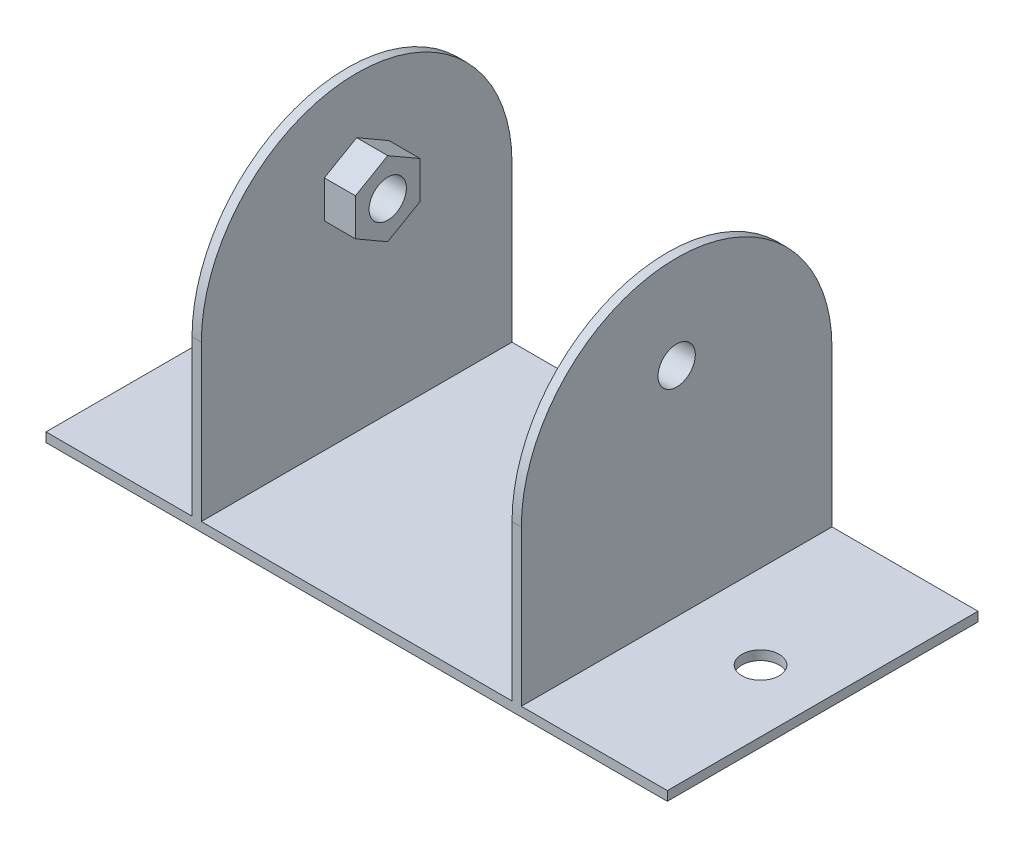
ISO-10303-21;
HEADER;
FILE_DESCRIPTION(('STEP AP214'),'2;1');
FILE_NAME('part.step','',(''),(''),'','','');
FILE_SCHEMA(('AUTOMOTIVE_DESIGN { 1 0 10303 214 1 1 1 1 }'));
ENDSEC;
DATA;
#1=APPLICATION_CONTEXT('core data for automotive mechanical design processes');
#2=APPLICATION_PROTOCOL_DEFINITION('international standard','automotive_design',2000,#1);
#3=PRODUCT_CONTEXT('',#1,'mechanical');
#4=PRODUCT('Part','Part','',(#3));
#5=PRODUCT_RELATED_PRODUCT_CATEGORY('part','',(#4));
#6=PRODUCT_DEFINITION_FORMATION('','',#4);
#7=PRODUCT_DEFINITION_CONTEXT('part definition',#1,'design');
#8=PRODUCT_DEFINITION('design','',#6,#7);
#9=PRODUCT_DEFINITION_SHAPE('','',#8);
#10=(LENGTH_UNIT() NAMED_UNIT(*) SI_UNIT(.MILLI.,.METRE.));
#11=(NAMED_UNIT(*) PLANE_ANGLE_UNIT() SI_UNIT($,.RADIAN.));
#12=(NAMED_UNIT(*) SI_UNIT($,.STERADIAN.) SOLID_ANGLE_UNIT());
#13=UNCERTAINTY_MEASURE_WITH_UNIT(LENGTH_MEASURE(1.E-05),#10,'distance_accuracy_value','');
#14=(GEOMETRIC_REPRESENTATION_CONTEXT(3) GLOBAL_UNCERTAINTY_ASSIGNED_CONTEXT((#13)) GLOBAL_UNIT_ASSIGNED_CONTEXT((#10,
#11,#12)) REPRESENTATION_CONTEXT('',''));
#15=CARTESIAN_POINT('',(0.,0.,0.));
#16=DIRECTION('',(0.,0.,1.));
#17=DIRECTION('',(1.,0.,0.));
#18=AXIS2_PLACEMENT_3D('',#15,#16,#17);
#19=CARTESIAN_POINT('',(-25.,50.,50.));
#20=DIRECTION('',(-1.,0.,0.));
#21=DIRECTION('',(0.,-1.,0.));
#22=AXIS2_PLACEMENT_3D('',#19,#20,#21);
#23=PLANE('',#22);
#24=DIRECTION('',(0.,1.,0.));
#25=VECTOR('',#24,1.);
#26=CARTESIAN_POINT('',(-25.,50.,0.));
#27=LINE('',#26,#25);
#28=CARTESIAN_POINT('',(-25.,0.,0.));
#29=VERTEX_POINT('',#28);
#30=CARTESIAN_POINT('',(-25.,25.,0.));
#31=VERTEX_POINT('',#30);
#32=EDGE_CURVE('E357',#29,#31,#27,.T.);
#33=ORIENTED_EDGE('',*,*,#32,.T.);
#34=CARTESIAN_POINT('',(-25.,25.,25.));
#35=DIRECTION('',(-1.,0.,0.));
#36=DIRECTION('',(0.,-1.,0.));
#37=AXIS2_PLACEMENT_3D('',#34,#35,#36);
#38=CIRCLE('',#37,25.);
#39=CARTESIAN_POINT('',(-25.,25.,50.));
#40=VERTEX_POINT('',#39);
#41=EDGE_CURVE('E44',#31,#40,#38,.F.);
#42=ORIENTED_EDGE('',*,*,#41,.T.);
#43=DIRECTION('',(0.,1.,0.));
#44=VECTOR('',#43,1.);
#45=CARTESIAN_POINT('',(-25.,50.,50.));
#46=LINE('',#45,#44);
#47=CARTESIAN_POINT('',(-25.,0.,50.));
#48=VERTEX_POINT('',#47);
#49=EDGE_CURVE('E334',#48,#40,#46,.T.);
#50=ORIENTED_EDGE('',*,*,#49,.F.);
#51=DIRECTION('',(0.,0.,-1.));
#52=VECTOR('',#51,1.);
#53=CARTESIAN_POINT('',(-25.,0.,50.));
#54=LINE('',#53,#52);
#55=EDGE_CURVE('E383',#48,#29,#54,.T.);
#56=ORIENTED_EDGE('',*,*,#55,.T.);
#57=EDGE_LOOP('',(#33,#42,#50,#56));
#58=FACE_BOUND('',#57,.T.);
#59=DIRECTION('',(0.,-1.,0.));
#60=VECTOR('',#59,1.);
#61=CARTESIAN_POINT('',(-25.,38.,30.1961524227066));
#62=LINE('',#61,#60);
#63=CARTESIAN_POINT('',(-25.,38.,30.1961524227066));
#64=VERTEX_POINT('',#63);
#65=CARTESIAN_POINT('',(-25.,32.,30.1961524227066));
#66=VERTEX_POINT('',#65);
#67=EDGE_CURVE('E258',#64,#66,#62,.T.);
#68=ORIENTED_EDGE('',*,*,#67,.F.);
#69=DIRECTION('',(0.,-0.5,0.866025403784438));
#70=VECTOR('',#69,1.);
#71=CARTESIAN_POINT('',(-25.,41.,25.));
#72=LINE('',#71,#70);
#73=CARTESIAN_POINT('',(-25.,41.,25.));
#74=VERTEX_POINT('',#73);
#75=EDGE_CURVE('E263',#74,#64,#72,.T.);
#76=ORIENTED_EDGE('',*,*,#75,.F.);
#77=DIRECTION('',(0.,0.5,0.866025403784439));
#78=VECTOR('',#77,1.);
#79=CARTESIAN_POINT('',(-25.,38.,19.8038475772934));
#80=LINE('',#79,#78);
#81=CARTESIAN_POINT('',(-25.,38.,19.8038475772934));
#82=VERTEX_POINT('',#81);
#83=EDGE_CURVE('E283',#82,#74,#80,.T.);
#84=ORIENTED_EDGE('',*,*,#83,.F.);
#85=DIRECTION('',(0.,1.,0.));
#86=VECTOR('',#85,1.);
#87=CARTESIAN_POINT('',(-25.,32.,19.8038475772934));
#88=LINE('',#87,#86);
#89=CARTESIAN_POINT('',(-25.,32.,19.8038475772934));
#90=VERTEX_POINT('',#89);
#91=EDGE_CURVE('E280',#90,#82,#88,.T.);
#92=ORIENTED_EDGE('',*,*,#91,.F.);
#93=DIRECTION('',(0.,0.500000000000001,-0.866025403784438));
#94=VECTOR('',#93,1.);
#95=CARTESIAN_POINT('',(-25.,29.,25.));
#96=LINE('',#95,#94);
#97=CARTESIAN_POINT('',(-25.,29.,25.));
#98=VERTEX_POINT('',#97);
#99=EDGE_CURVE('E277',#98,#90,#96,.T.);
#100=ORIENTED_EDGE('',*,*,#99,.F.);
#101=DIRECTION('',(0.,-0.500000000000002,-0.866025403784438));
#102=VECTOR('',#101,1.);
#103=CARTESIAN_POINT('',(-25.,32.,30.1961524227066));
#104=LINE('',#103,#102);
#105=EDGE_CURVE('E59',#66,#98,#104,.T.);
#106=ORIENTED_EDGE('',*,*,#105,.F.);
#107=EDGE_LOOP('',(#68,#76,#84,#92,#100,#106));
#108=FACE_BOUND('',#107,.T.);
#109=ADVANCED_FACE('F35',(#58,#108),#23,.F.);
#110=CARTESIAN_POINT('',(-25.,25.,25.));
#111=DIRECTION('',(-1.,0.,0.));
#112=DIRECTION('',(0.,0.,1.));
#113=AXIS2_PLACEMENT_3D('',#110,#111,#112);
#114=CYLINDRICAL_SURFACE('',#113,25.);
#115=DIRECTION('',(-1.,0.,0.));
#116=VECTOR('',#115,1.);
#117=CARTESIAN_POINT('',(0.,25.,50.));
#118=LINE('',#117,#116);
#119=CARTESIAN_POINT('',(-26.5,25.,50.));
#120=VERTEX_POINT('',#119);
#121=EDGE_CURVE('E402',#40,#120,#118,.T.);
#122=ORIENTED_EDGE('',*,*,#121,.F.);
#123=ORIENTED_EDGE('',*,*,#41,.F.);
#124=DIRECTION('',(1.,0.,0.));
#125=VECTOR('',#124,1.);
#126=CARTESIAN_POINT('',(-25.,25.,0.));
#127=LINE('',#126,#125);
#128=CARTESIAN_POINT('',(-26.5,25.,0.));
#129=VERTEX_POINT('',#128);
#130=EDGE_CURVE('E405',#129,#31,#127,.T.);
#131=ORIENTED_EDGE('',*,*,#130,.F.);
#132=CARTESIAN_POINT('',(-26.5,25.,25.));
#133=DIRECTION('',(1.,0.,0.));
#134=DIRECTION('',(0.,0.,-1.));
#135=AXIS2_PLACEMENT_3D('',#132,#133,#134);
#136=CIRCLE('',#135,25.);
#137=EDGE_CURVE('E11',#120,#129,#136,.F.);
#138=ORIENTED_EDGE('',*,*,#137,.F.);
#139=EDGE_LOOP('',(#122,#123,#131,#138));
#140=FACE_BOUND('',#139,.T.);
#141=ADVANCED_FACE('F38',(#140),#114,.T.);
#142=CARTESIAN_POINT('',(25.,25.,25.));
#143=DIRECTION('',(-1.,0.,0.));
#144=DIRECTION('',(0.,0.,1.));
#145=AXIS2_PLACEMENT_3D('',#142,#143,#144);
#146=CYLINDRICAL_SURFACE('',#145,25.);
#147=DIRECTION('',(1.,0.,0.));
#148=VECTOR('',#147,1.);
#149=CARTESIAN_POINT('',(25.,25.,0.));
#150=LINE('',#149,#148);
#151=CARTESIAN_POINT('',(25.,25.,0.));
#152=VERTEX_POINT('',#151);
#153=CARTESIAN_POINT('',(26.5,25.,0.));
#154=VERTEX_POINT('',#153);
#155=EDGE_CURVE('E392',#152,#154,#150,.T.);
#156=ORIENTED_EDGE('',*,*,#155,.F.);
#157=CARTESIAN_POINT('',(25.,25.,25.));
#158=DIRECTION('',(1.,0.,0.));
#159=DIRECTION('',(0.,1.,0.));
#160=AXIS2_PLACEMENT_3D('',#157,#158,#159);
#161=CIRCLE('',#160,25.);
#162=CARTESIAN_POINT('',(25.,25.,50.));
#163=VERTEX_POINT('',#162);
#164=EDGE_CURVE('E398',#163,#152,#161,.F.);
#165=ORIENTED_EDGE('',*,*,#164,.F.);
#166=DIRECTION('',(-1.,0.,0.));
#167=VECTOR('',#166,1.);
#168=CARTESIAN_POINT('',(0.,25.,50.));
#169=LINE('',#168,#167);
#170=CARTESIAN_POINT('',(26.5,25.,50.));
#171=VERTEX_POINT('',#170);
#172=EDGE_CURVE('E395',#171,#163,#169,.T.);
#173=ORIENTED_EDGE('',*,*,#172,.F.);
#174=CARTESIAN_POINT('',(26.5,25.,25.));
#175=DIRECTION('',(-1.,0.,0.));
#176=DIRECTION('',(0.,0.,1.));
#177=AXIS2_PLACEMENT_3D('',#174,#175,#176);
#178=CIRCLE('',#177,25.);
#179=EDGE_CURVE('E400',#154,#171,#178,.F.);
#180=ORIENTED_EDGE('',*,*,#179,.F.);
#181=EDGE_LOOP('',(#156,#165,#173,#180));
#182=FACE_BOUND('',#181,.T.);
#183=ADVANCED_FACE('F460',(#182),#146,.T.);
#184=CARTESIAN_POINT('',(50.,0.,50.));
#185=DIRECTION('',(0.,-1.,0.));
#186=DIRECTION('',(0.,0.,-1.));
#187=AXIS2_PLACEMENT_3D('',#184,#185,#186);
#188=PLANE('',#187);
#189=CARTESIAN_POINT('',(40.,0.,25.));
#190=DIRECTION('',(0.,1.,0.));
#191=DIRECTION('',(0.,0.,-1.));
#192=AXIS2_PLACEMENT_3D('',#189,#190,#191);
#193=CIRCLE('',#192,3.);
#194=CARTESIAN_POINT('',(40.,0.,22.));
#195=VERTEX_POINT('',#194);
#196=EDGE_CURVE('E310',#195,#195,#193,.T.);
#197=ORIENTED_EDGE('',*,*,#196,.F.);
#198=EDGE_LOOP('',(#197));
#199=FACE_BOUND('',#198,.T.);
#200=DIRECTION('',(-1.,0.,0.));
#201=VECTOR('',#200,1.);
#202=CARTESIAN_POINT('',(50.,0.,0.));
#203=LINE('',#202,#201);
#204=CARTESIAN_POINT('',(50.,0.,0.));
#205=VERTEX_POINT('',#204);
#206=CARTESIAN_POINT('',(26.5,0.,0.));
#207=VERTEX_POINT('',#206);
#208=EDGE_CURVE('E318',#205,#207,#203,.T.);
#209=ORIENTED_EDGE('',*,*,#208,.T.);
#210=DIRECTION('',(0.,0.,-1.));
#211=VECTOR('',#210,1.);
#212=CARTESIAN_POINT('',(26.5,0.,50.));
#213=LINE('',#212,#211);
#214=CARTESIAN_POINT('',(26.5,0.,50.));
#215=VERTEX_POINT('',#214);
#216=EDGE_CURVE('E389',#215,#207,#213,.T.);
#217=ORIENTED_EDGE('',*,*,#216,.F.);
#218=DIRECTION('',(-1.,0.,0.));
#219=VECTOR('',#218,1.);
#220=CARTESIAN_POINT('',(50.,0.,50.));
#221=LINE('',#220,#219);
#222=CARTESIAN_POINT('',(50.,0.,50.));
#223=VERTEX_POINT('',#222);
#224=EDGE_CURVE('E323',#223,#215,#221,.T.);
#225=ORIENTED_EDGE('',*,*,#224,.F.);
#226=DIRECTION('',(0.,0.,-1.));
#227=VECTOR('',#226,1.);
#228=CARTESIAN_POINT('',(50.,0.,50.));
#229=LINE('',#228,#227);
#230=EDGE_CURVE('E347',#223,#205,#229,.T.);
#231=ORIENTED_EDGE('',*,*,#230,.T.);
#232=EDGE_LOOP('',(#209,#217,#225,#231));
#233=FACE_BOUND('',#232,.T.);
#234=ADVANCED_FACE('F453',(#199,#233),#188,.F.);
#235=CARTESIAN_POINT('',(26.5,0.,50.));
#236=DIRECTION('',(-1.,0.,0.));
#237=DIRECTION('',(0.,0.,1.));
#238=AXIS2_PLACEMENT_3D('',#235,#236,#237);
#239=PLANE('',#238);
#240=CARTESIAN_POINT('',(26.5,35.,25.));
#241=DIRECTION('',(-1.,0.,0.));
#242=DIRECTION('',(0.,0.,1.));
#243=AXIS2_PLACEMENT_3D('',#240,#241,#242);
#244=CIRCLE('',#243,3.);
#245=CARTESIAN_POINT('',(26.5,35.,28.));
#246=VERTEX_POINT('',#245);
#247=EDGE_CURVE('E307',#246,#246,#244,.T.);
#248=ORIENTED_EDGE('',*,*,#247,.T.);
#249=EDGE_LOOP('',(#248));
#250=FACE_BOUND('',#249,.T.);
#251=DIRECTION('',(0.,1.,0.));
#252=VECTOR('',#251,1.);
#253=CARTESIAN_POINT('',(26.5,0.,0.));
#254=LINE('',#253,#252);
#255=EDGE_CURVE('E350',#207,#154,#254,.T.);
#256=ORIENTED_EDGE('',*,*,#255,.T.);
#257=ORIENTED_EDGE('',*,*,#179,.T.);
#258=DIRECTION('',(0.,1.,0.));
#259=VECTOR('',#258,1.);
#260=CARTESIAN_POINT('',(26.5,0.,50.));
#261=LINE('',#260,#259);
#262=EDGE_CURVE('E326',#215,#171,#261,.T.);
#263=ORIENTED_EDGE('',*,*,#262,.F.);
#264=ORIENTED_EDGE('',*,*,#216,.T.);
#265=EDGE_LOOP('',(#256,#257,#263,#264));
#266=FACE_BOUND('',#265,.T.);
#267=ADVANCED_FACE('F456',(#250,#266),#239,.F.);
#268=CARTESIAN_POINT('',(25.,50.,50.));
#269=DIRECTION('',(1.,0.,0.));
#270=DIRECTION('',(0.,1.,0.));
#271=AXIS2_PLACEMENT_3D('',#268,#269,#270);
#272=PLANE('',#271);
#273=DIRECTION('',(0.,-0.5,0.866025403784438));
#274=VECTOR('',#273,1.);
#275=CARTESIAN_POINT('',(25.,41.,25.));
#276=LINE('',#275,#274);
#277=CARTESIAN_POINT('',(25.,41.,25.));
#278=VERTEX_POINT('',#277);
#279=CARTESIAN_POINT('',(25.,38.,30.1961524227066));
#280=VERTEX_POINT('',#279);
#281=EDGE_CURVE('E236',#278,#280,#276,.T.);
#282=ORIENTED_EDGE('',*,*,#281,.T.);
#283=DIRECTION('',(0.,-1.,0.));
#284=VECTOR('',#283,1.);
#285=CARTESIAN_POINT('',(25.,38.,30.1961524227066));
#286=LINE('',#285,#284);
#287=CARTESIAN_POINT('',(25.,32.,30.1961524227066));
#288=VERTEX_POINT('',#287);
#289=EDGE_CURVE('E202',#280,#288,#286,.T.);
#290=ORIENTED_EDGE('',*,*,#289,.T.);
#291=DIRECTION('',(0.,-0.500000000000002,-0.866025403784438));
#292=VECTOR('',#291,1.);
#293=CARTESIAN_POINT('',(25.,32.,30.1961524227066));
#294=LINE('',#293,#292);
#295=CARTESIAN_POINT('',(25.,29.,25.));
#296=VERTEX_POINT('',#295);
#297=EDGE_CURVE('E219',#288,#296,#294,.T.);
#298=ORIENTED_EDGE('',*,*,#297,.T.);
#299=DIRECTION('',(0.,0.500000000000001,-0.866025403784438));
#300=VECTOR('',#299,1.);
#301=CARTESIAN_POINT('',(25.,29.,25.));
#302=LINE('',#301,#300);
#303=CARTESIAN_POINT('',(25.,32.,19.8038475772934));
#304=VERTEX_POINT('',#303);
#305=EDGE_CURVE('E51',#296,#304,#302,.T.);
#306=ORIENTED_EDGE('',*,*,#305,.T.);
#307=DIRECTION('',(0.,1.,0.));
#308=VECTOR('',#307,1.);
#309=CARTESIAN_POINT('',(25.,32.,19.8038475772934));
#310=LINE('',#309,#308);
#311=CARTESIAN_POINT('',(25.,38.,19.8038475772934));
#312=VERTEX_POINT('',#311);
#313=EDGE_CURVE('E242',#304,#312,#310,.T.);
#314=ORIENTED_EDGE('',*,*,#313,.T.);
#315=DIRECTION('',(0.,0.5,0.866025403784439));
#316=VECTOR('',#315,1.);
#317=CARTESIAN_POINT('',(25.,38.,19.8038475772934));
#318=LINE('',#317,#316);
#319=EDGE_CURVE('E239',#312,#278,#318,.T.);
#320=ORIENTED_EDGE('',*,*,#319,.T.);
#321=EDGE_LOOP('',(#282,#290,#298,#306,#314,#320));
#322=FACE_BOUND('',#321,.T.);
#323=DIRECTION('',(0.,-1.,0.));
#324=VECTOR('',#323,1.);
#325=CARTESIAN_POINT('',(25.,50.,50.));
#326=LINE('',#325,#324);
#327=CARTESIAN_POINT('',(25.,0.,50.));
#328=VERTEX_POINT('',#327);
#329=EDGE_CURVE('E330',#163,#328,#326,.T.);
#330=ORIENTED_EDGE('',*,*,#329,.F.);
#331=ORIENTED_EDGE('',*,*,#164,.T.);
#332=DIRECTION('',(0.,-1.,0.));
#333=VECTOR('',#332,1.);
#334=CARTESIAN_POINT('',(25.,50.,0.));
#335=LINE('',#334,#333);
#336=CARTESIAN_POINT('',(25.,0.,0.));
#337=VERTEX_POINT('',#336);
#338=EDGE_CURVE('E353',#152,#337,#335,.T.);
#339=ORIENTED_EDGE('',*,*,#338,.T.);
#340=DIRECTION('',(0.,0.,-1.));
#341=VECTOR('',#340,1.);
#342=CARTESIAN_POINT('',(25.,0.,50.));
#343=LINE('',#342,#341);
#344=EDGE_CURVE('E386',#328,#337,#343,.T.);
#345=ORIENTED_EDGE('',*,*,#344,.F.);
#346=EDGE_LOOP('',(#330,#331,#339,#345));
#347=FACE_BOUND('',#346,.T.);
#348=ADVANCED_FACE('F462',(#322,#347),#272,.F.);
#349=CARTESIAN_POINT('',(-25.,0.,50.));
#350=DIRECTION('',(0.,-1.,0.));
#351=DIRECTION('',(0.,0.,-1.));
#352=AXIS2_PLACEMENT_3D('',#349,#350,#351);
#353=PLANE('',#352);
#354=DIRECTION('',(-1.,0.,0.));
#355=VECTOR('',#354,1.);
#356=CARTESIAN_POINT('',(-25.,0.,0.));
#357=LINE('',#356,#355);
#358=EDGE_CURVE('E355',#337,#29,#357,.T.);
#359=ORIENTED_EDGE('',*,*,#358,.T.);
#360=ORIENTED_EDGE('',*,*,#55,.F.);
#361=DIRECTION('',(-1.,0.,0.));
#362=VECTOR('',#361,1.);
#363=CARTESIAN_POINT('',(-25.,0.,50.));
#364=LINE('',#363,#362);
#365=EDGE_CURVE('E332',#328,#48,#364,.T.);
#366=ORIENTED_EDGE('',*,*,#365,.F.);
#367=ORIENTED_EDGE('',*,*,#344,.T.);
#368=EDGE_LOOP('',(#359,#360,#366,#367));
#369=FACE_BOUND('',#368,.T.);
#370=ADVANCED_FACE('F421',(#369),#353,.F.);
#371=CARTESIAN_POINT('',(-26.5,0.,50.));
#372=DIRECTION('',(1.,0.,0.));
#373=DIRECTION('',(0.,0.,-1.));
#374=AXIS2_PLACEMENT_3D('',#371,#372,#373);
#375=PLANE('',#374);
#376=CARTESIAN_POINT('',(-26.5,35.,25.));
#377=DIRECTION('',(-1.,0.,0.));
#378=DIRECTION('',(0.,-1.,0.));
#379=AXIS2_PLACEMENT_3D('',#376,#377,#378);
#380=CIRCLE('',#379,3.);
#381=CARTESIAN_POINT('',(-26.5,32.,25.));
#382=VERTEX_POINT('',#381);
#383=EDGE_CURVE('E304',#382,#382,#380,.T.);
#384=ORIENTED_EDGE('',*,*,#383,.F.);
#385=EDGE_LOOP('',(#384));
#386=FACE_BOUND('',#385,.T.);
#387=DIRECTION('',(0.,-1.,0.));
#388=VECTOR('',#387,1.);
#389=CARTESIAN_POINT('',(-26.5,0.,50.));
#390=LINE('',#389,#388);
#391=CARTESIAN_POINT('',(-26.5,0.,50.));
#392=VERTEX_POINT('',#391);
#393=EDGE_CURVE('E337',#120,#392,#390,.T.);
#394=ORIENTED_EDGE('',*,*,#393,.F.);
#395=ORIENTED_EDGE('',*,*,#137,.T.);
#396=DIRECTION('',(0.,-1.,0.));
#397=VECTOR('',#396,1.);
#398=CARTESIAN_POINT('',(-26.5,0.,0.));
#399=LINE('',#398,#397);
#400=CARTESIAN_POINT('',(-26.5,0.,0.));
#401=VERTEX_POINT('',#400);
#402=EDGE_CURVE('E360',#129,#401,#399,.T.);
#403=ORIENTED_EDGE('',*,*,#402,.T.);
#404=DIRECTION('',(0.,0.,-1.));
#405=VECTOR('',#404,1.);
#406=CARTESIAN_POINT('',(-26.5,0.,50.));
#407=LINE('',#406,#405);
#408=EDGE_CURVE('E380',#392,#401,#407,.T.);
#409=ORIENTED_EDGE('',*,*,#408,.F.);
#410=EDGE_LOOP('',(#394,#395,#403,#409));
#411=FACE_BOUND('',#410,.T.);
#412=ADVANCED_FACE('F431',(#386,#411),#375,.F.);
#413=CARTESIAN_POINT('',(-50.,0.,50.));
#414=DIRECTION('',(0.,-1.,0.));
#415=DIRECTION('',(0.,0.,-1.));
#416=AXIS2_PLACEMENT_3D('',#413,#414,#415);
#417=PLANE('',#416);
#418=CARTESIAN_POINT('',(-40.,0.,25.));
#419=DIRECTION('',(0.,1.,0.));
#420=DIRECTION('',(0.,0.,1.));
#421=AXIS2_PLACEMENT_3D('',#418,#419,#420);
#422=CIRCLE('',#421,3.);
#423=CARTESIAN_POINT('',(-40.,0.,28.));
#424=VERTEX_POINT('',#423);
#425=EDGE_CURVE('E311',#424,#424,#422,.T.);
#426=ORIENTED_EDGE('',*,*,#425,.F.);
#427=EDGE_LOOP('',(#426));
#428=FACE_BOUND('',#427,.T.);
#429=DIRECTION('',(-1.,0.,0.));
#430=VECTOR('',#429,1.);
#431=CARTESIAN_POINT('',(-50.,0.,0.));
#432=LINE('',#431,#430);
#433=CARTESIAN_POINT('',(-50.,0.,0.));
#434=VERTEX_POINT('',#433);
#435=EDGE_CURVE('E362',#401,#434,#432,.T.);
#436=ORIENTED_EDGE('',*,*,#435,.T.);
#437=DIRECTION('',(0.,0.,-1.));
#438=VECTOR('',#437,1.);
#439=CARTESIAN_POINT('',(-50.,0.,50.));
#440=LINE('',#439,#438);
#441=CARTESIAN_POINT('',(-50.,0.,50.));
#442=VERTEX_POINT('',#441);
#443=EDGE_CURVE('E377',#442,#434,#440,.T.);
#444=ORIENTED_EDGE('',*,*,#443,.F.);
#445=DIRECTION('',(-1.,0.,0.));
#446=VECTOR('',#445,1.);
#447=CARTESIAN_POINT('',(-50.,0.,50.));
#448=LINE('',#447,#446);
#449=EDGE_CURVE('E339',#392,#442,#448,.T.);
#450=ORIENTED_EDGE('',*,*,#449,.F.);
#451=ORIENTED_EDGE('',*,*,#408,.T.);
#452=EDGE_LOOP('',(#436,#444,#450,#451));
#453=FACE_BOUND('',#452,.T.);
#454=ADVANCED_FACE('F434',(#428,#453),#417,.F.);
#455=CARTESIAN_POINT('',(-50.,-1.50000000000001,50.));
#456=DIRECTION('',(1.,0.,0.));
#457=DIRECTION('',(0.,0.,-1.));
#458=AXIS2_PLACEMENT_3D('',#455,#456,#457);
#459=PLANE('',#458);
#460=DIRECTION('',(0.,-1.,0.));
#461=VECTOR('',#460,1.);
#462=CARTESIAN_POINT('',(-50.,-1.50000000000001,0.));
#463=LINE('',#462,#461);
#464=CARTESIAN_POINT('',(-50.,-1.50000000000001,0.));
#465=VERTEX_POINT('',#464);
#466=EDGE_CURVE('E364',#434,#465,#463,.T.);
#467=ORIENTED_EDGE('',*,*,#466,.T.);
#468=DIRECTION('',(0.,0.,-1.));
#469=VECTOR('',#468,1.);
#470=CARTESIAN_POINT('',(-50.,-1.50000000000001,50.));
#471=LINE('',#470,#469);
#472=CARTESIAN_POINT('',(-50.,-1.50000000000001,50.));
#473=VERTEX_POINT('',#472);
#474=EDGE_CURVE('E374',#473,#465,#471,.T.);
#475=ORIENTED_EDGE('',*,*,#474,.F.);
#476=DIRECTION('',(0.,-1.,0.));
#477=VECTOR('',#476,1.);
#478=CARTESIAN_POINT('',(-50.,-1.50000000000001,50.));
#479=LINE('',#478,#477);
#480=EDGE_CURVE('E341',#442,#473,#479,.T.);
#481=ORIENTED_EDGE('',*,*,#480,.F.);
#482=ORIENTED_EDGE('',*,*,#443,.T.);
#483=EDGE_LOOP('',(#467,#475,#481,#482));
#484=FACE_BOUND('',#483,.T.);
#485=ADVANCED_FACE('F441',(#484),#459,.F.);
#486=CARTESIAN_POINT('',(50.,-1.50000000000001,50.));
#487=DIRECTION('',(0.,1.,0.));
#488=DIRECTION('',(0.,0.,1.));
#489=AXIS2_PLACEMENT_3D('',#486,#487,#488);
#490=PLANE('',#489);
#491=CARTESIAN_POINT('',(-40.,-1.50000000000001,25.));
#492=DIRECTION('',(0.,1.,0.));
#493=DIRECTION('',(0.,0.,1.));
#494=AXIS2_PLACEMENT_3D('',#491,#492,#493);
#495=CIRCLE('',#494,3.);
#496=CARTESIAN_POINT('',(-40.,-1.50000000000001,28.));
#497=VERTEX_POINT('',#496);
#498=EDGE_CURVE('E314',#497,#497,#495,.F.);
#499=ORIENTED_EDGE('',*,*,#498,.F.);
#500=EDGE_LOOP('',(#499));
#501=FACE_BOUND('',#500,.T.);
#502=CARTESIAN_POINT('',(40.,-1.50000000000001,25.));
#503=DIRECTION('',(0.,1.,0.));
#504=DIRECTION('',(0.,0.,1.));
#505=AXIS2_PLACEMENT_3D('',#502,#503,#504);
#506=CIRCLE('',#505,3.);
#507=CARTESIAN_POINT('',(40.,-1.50000000000001,28.));
#508=VERTEX_POINT('',#507);
#509=EDGE_CURVE('E315',#508,#508,#506,.F.);
#510=ORIENTED_EDGE('',*,*,#509,.F.);
#511=EDGE_LOOP('',(#510));
#512=FACE_BOUND('',#511,.T.);
#513=DIRECTION('',(1.,0.,0.));
#514=VECTOR('',#513,1.);
#515=CARTESIAN_POINT('',(50.,-1.50000000000001,0.));
#516=LINE('',#515,#514);
#517=CARTESIAN_POINT('',(50.,-1.50000000000001,0.));
#518=VERTEX_POINT('',#517);
#519=EDGE_CURVE('E366',#465,#518,#516,.T.);
#520=ORIENTED_EDGE('',*,*,#519,.T.);
#521=DIRECTION('',(0.,0.,-1.));
#522=VECTOR('',#521,1.);
#523=CARTESIAN_POINT('',(50.,-1.50000000000001,50.));
#524=LINE('',#523,#522);
#525=CARTESIAN_POINT('',(50.,-1.50000000000001,50.));
#526=VERTEX_POINT('',#525);
#527=EDGE_CURVE('E371',#526,#518,#524,.T.);
#528=ORIENTED_EDGE('',*,*,#527,.F.);
#529=DIRECTION('',(1.,0.,0.));
#530=VECTOR('',#529,1.);
#531=CARTESIAN_POINT('',(50.,-1.50000000000001,50.));
#532=LINE('',#531,#530);
#533=EDGE_CURVE('E343',#473,#526,#532,.T.);
#534=ORIENTED_EDGE('',*,*,#533,.F.);
#535=ORIENTED_EDGE('',*,*,#474,.T.);
#536=EDGE_LOOP('',(#520,#528,#534,#535));
#537=FACE_BOUND('',#536,.T.);
#538=ADVANCED_FACE('F444',(#501,#512,#537),#490,.F.);
#539=CARTESIAN_POINT('',(50.,-1.50000000000001,50.));
#540=DIRECTION('',(-1.,0.,0.));
#541=DIRECTION('',(0.,0.,1.));
#542=AXIS2_PLACEMENT_3D('',#539,#540,#541);
#543=PLANE('',#542);
#544=DIRECTION('',(0.,1.,0.));
#545=VECTOR('',#544,1.);
#546=CARTESIAN_POINT('',(50.,-1.50000000000001,0.));
#547=LINE('',#546,#545);
#548=EDGE_CURVE('E327',#518,#205,#547,.T.);
#549=ORIENTED_EDGE('',*,*,#548,.T.);
#550=ORIENTED_EDGE('',*,*,#230,.F.);
#551=DIRECTION('',(0.,1.,0.));
#552=VECTOR('',#551,1.);
#553=CARTESIAN_POINT('',(50.,-1.50000000000001,50.));
#554=LINE('',#553,#552);
#555=EDGE_CURVE('E345',#526,#223,#554,.T.);
#556=ORIENTED_EDGE('',*,*,#555,.F.);
#557=ORIENTED_EDGE('',*,*,#527,.T.);
#558=EDGE_LOOP('',(#549,#550,#556,#557));
#559=FACE_BOUND('',#558,.T.);
#560=ADVANCED_FACE('F449',(#559),#543,.F.);
#561=CARTESIAN_POINT('',(0.,0.,50.));
#562=DIRECTION('',(0.,0.,-1.));
#563=DIRECTION('',(-1.,0.,0.));
#564=AXIS2_PLACEMENT_3D('',#561,#562,#563);
#565=PLANE('',#564);
#566=ORIENTED_EDGE('',*,*,#49,.T.);
#567=ORIENTED_EDGE('',*,*,#121,.T.);
#568=ORIENTED_EDGE('',*,*,#393,.T.);
#569=ORIENTED_EDGE('',*,*,#449,.T.);
#570=ORIENTED_EDGE('',*,*,#480,.T.);
#571=ORIENTED_EDGE('',*,*,#533,.T.);
#572=ORIENTED_EDGE('',*,*,#555,.T.);
#573=ORIENTED_EDGE('',*,*,#224,.T.);
#574=ORIENTED_EDGE('',*,*,#262,.T.);
#575=ORIENTED_EDGE('',*,*,#172,.T.);
#576=ORIENTED_EDGE('',*,*,#329,.T.);
#577=ORIENTED_EDGE('',*,*,#365,.T.);
#578=EDGE_LOOP('',(#566,#567,#568,#569,#570,#571,#572,#573,#574,#575,#576,#577));
#579=FACE_BOUND('',#578,.T.);
#580=ADVANCED_FACE('F415',(#579),#565,.F.);
#581=CARTESIAN_POINT('',(0.,0.,0.));
#582=DIRECTION('',(0.,0.,-1.));
#583=DIRECTION('',(-1.,0.,0.));
#584=AXIS2_PLACEMENT_3D('',#581,#582,#583);
#585=PLANE('',#584);
#586=ORIENTED_EDGE('',*,*,#402,.F.);
#587=ORIENTED_EDGE('',*,*,#130,.T.);
#588=ORIENTED_EDGE('',*,*,#32,.F.);
#589=ORIENTED_EDGE('',*,*,#358,.F.);
#590=ORIENTED_EDGE('',*,*,#338,.F.);
#591=ORIENTED_EDGE('',*,*,#155,.T.);
#592=ORIENTED_EDGE('',*,*,#255,.F.);
#593=ORIENTED_EDGE('',*,*,#208,.F.);
#594=ORIENTED_EDGE('',*,*,#548,.F.);
#595=ORIENTED_EDGE('',*,*,#519,.F.);
#596=ORIENTED_EDGE('',*,*,#466,.F.);
#597=ORIENTED_EDGE('',*,*,#435,.F.);
#598=EDGE_LOOP('',(#586,#587,#588,#589,#590,#591,#592,#593,#594,#595,#596,#597));
#599=FACE_BOUND('',#598,.T.);
#600=ADVANCED_FACE('F425',(#599),#585,.T.);
#601=CARTESIAN_POINT('',(40.,-1.50100000000001,25.));
#602=DIRECTION('',(0.,1.,0.));
#603=DIRECTION('',(0.,0.,1.));
#604=AXIS2_PLACEMENT_3D('',#601,#602,#603);
#605=CYLINDRICAL_SURFACE('',#604,3.);
#606=ORIENTED_EDGE('',*,*,#196,.T.);
#607=EDGE_LOOP('',(#606));
#608=FACE_BOUND('',#607,.T.);
#609=ORIENTED_EDGE('',*,*,#509,.T.);
#610=EDGE_LOOP('',(#609));
#611=FACE_BOUND('',#610,.T.);
#612=ADVANCED_FACE('F498',(#608,#611),#605,.F.);
#613=CARTESIAN_POINT('',(-40.,-1.50100000000001,25.));
#614=DIRECTION('',(0.,1.,0.));
#615=DIRECTION('',(0.,0.,1.));
#616=AXIS2_PLACEMENT_3D('',#613,#614,#615);
#617=CYLINDRICAL_SURFACE('',#616,3.);
#618=ORIENTED_EDGE('',*,*,#425,.T.);
#619=EDGE_LOOP('',(#618));
#620=FACE_BOUND('',#619,.T.);
#621=ORIENTED_EDGE('',*,*,#498,.T.);
#622=EDGE_LOOP('',(#621));
#623=FACE_BOUND('',#622,.T.);
#624=ADVANCED_FACE('F503',(#620,#623),#617,.F.);
#625=CARTESIAN_POINT('',(43.5,35.,25.));
#626=DIRECTION('',(-1.,0.,0.));
#627=DIRECTION('',(0.,-1.,0.));
#628=AXIS2_PLACEMENT_3D('',#625,#626,#627);
#629=CYLINDRICAL_SURFACE('',#628,3.);
#630=ORIENTED_EDGE('',*,*,#383,.T.);
#631=EDGE_LOOP('',(#630));
#632=FACE_BOUND('',#631,.T.);
#633=CARTESIAN_POINT('',(-20.,35.,25.));
#634=DIRECTION('',(1.,0.,0.));
#635=DIRECTION('',(0.,1.,0.));
#636=AXIS2_PLACEMENT_3D('',#633,#634,#635);
#637=CIRCLE('',#636,3.);
#638=CARTESIAN_POINT('',(-20.,38.,25.));
#639=VERTEX_POINT('',#638);
#640=EDGE_CURVE('E207',#639,#639,#637,.T.);
#641=ORIENTED_EDGE('',*,*,#640,.T.);
#642=EDGE_LOOP('',(#641));
#643=FACE_BOUND('',#642,.T.);
#644=ADVANCED_FACE('F507',(#632,#643),#629,.F.);
#645=ORIENTED_EDGE('',*,*,#247,.F.);
#646=EDGE_LOOP('',(#645));
#647=FACE_BOUND('',#646,.T.);
#648=CARTESIAN_POINT('',(20.,35.,25.));
#649=DIRECTION('',(1.,0.,0.));
#650=DIRECTION('',(0.,1.,0.));
#651=AXIS2_PLACEMENT_3D('',#648,#649,#650);
#652=CIRCLE('',#651,3.);
#653=CARTESIAN_POINT('',(20.,38.,25.));
#654=VERTEX_POINT('',#653);
#655=EDGE_CURVE('E237',#654,#654,#652,.T.);
#656=ORIENTED_EDGE('',*,*,#655,.F.);
#657=EDGE_LOOP('',(#656));
#658=FACE_BOUND('',#657,.T.);
#659=ADVANCED_FACE('F509',(#647,#658),#629,.F.);
#660=CARTESIAN_POINT('',(-20.,0.,0.));
#661=DIRECTION('',(1.,0.,0.));
#662=DIRECTION('',(0.,0.,-1.));
#663=AXIS2_PLACEMENT_3D('',#660,#661,#662);
#664=PLANE('',#663);
#665=DIRECTION('',(0.,-1.,0.));
#666=VECTOR('',#665,1.);
#667=CARTESIAN_POINT('',(-20.,38.,30.1961524227066));
#668=LINE('',#667,#666);
#669=CARTESIAN_POINT('',(-20.,38.,30.1961524227066));
#670=VERTEX_POINT('',#669);
#671=CARTESIAN_POINT('',(-20.,32.,30.1961524227066));
#672=VERTEX_POINT('',#671);
#673=EDGE_CURVE('E259',#670,#672,#668,.T.);
#674=ORIENTED_EDGE('',*,*,#673,.T.);
#675=DIRECTION('',(0.,-0.500000000000002,-0.866025403784438));
#676=VECTOR('',#675,1.);
#677=CARTESIAN_POINT('',(-20.,32.,30.1961524227066));
#678=LINE('',#677,#676);
#679=CARTESIAN_POINT('',(-20.,29.,25.));
#680=VERTEX_POINT('',#679);
#681=EDGE_CURVE('E262',#672,#680,#678,.T.);
#682=ORIENTED_EDGE('',*,*,#681,.T.);
#683=DIRECTION('',(0.,0.500000000000001,-0.866025403784438));
#684=VECTOR('',#683,1.);
#685=CARTESIAN_POINT('',(-20.,29.,25.));
#686=LINE('',#685,#684);
#687=CARTESIAN_POINT('',(-20.,32.,19.8038475772934));
#688=VERTEX_POINT('',#687);
#689=EDGE_CURVE('E265',#680,#688,#686,.T.);
#690=ORIENTED_EDGE('',*,*,#689,.T.);
#691=DIRECTION('',(0.,1.,0.));
#692=VECTOR('',#691,1.);
#693=CARTESIAN_POINT('',(-20.,32.,19.8038475772934));
#694=LINE('',#693,#692);
#695=CARTESIAN_POINT('',(-20.,38.,19.8038475772934));
#696=VERTEX_POINT('',#695);
#697=EDGE_CURVE('E267',#688,#696,#694,.T.);
#698=ORIENTED_EDGE('',*,*,#697,.T.);
#699=DIRECTION('',(0.,0.5,0.866025403784439));
#700=VECTOR('',#699,1.);
#701=CARTESIAN_POINT('',(-20.,38.,19.8038475772934));
#702=LINE('',#701,#700);
#703=CARTESIAN_POINT('',(-20.,41.,25.));
#704=VERTEX_POINT('',#703);
#705=EDGE_CURVE('E269',#696,#704,#702,.T.);
#706=ORIENTED_EDGE('',*,*,#705,.T.);
#707=DIRECTION('',(0.,-0.5,0.866025403784438));
#708=VECTOR('',#707,1.);
#709=CARTESIAN_POINT('',(-20.,41.,25.));
#710=LINE('',#709,#708);
#711=EDGE_CURVE('E271',#704,#670,#710,.T.);
#712=ORIENTED_EDGE('',*,*,#711,.T.);
#713=EDGE_LOOP('',(#674,#682,#690,#698,#706,#712));
#714=FACE_BOUND('',#713,.T.);
#715=ORIENTED_EDGE('',*,*,#640,.F.);
#716=EDGE_LOOP('',(#715));
#717=FACE_BOUND('',#716,.T.);
#718=ADVANCED_FACE('F512',(#714,#717),#664,.T.);
#719=CARTESIAN_POINT('',(-20.,38.,30.1961524227066));
#720=DIRECTION('',(0.,0.,-1.));
#721=DIRECTION('',(-1.,0.,0.));
#722=AXIS2_PLACEMENT_3D('',#719,#720,#721);
#723=PLANE('',#722);
#724=ORIENTED_EDGE('',*,*,#67,.T.);
#725=DIRECTION('',(-1.,0.,0.));
#726=VECTOR('',#725,1.);
#727=CARTESIAN_POINT('',(-20.,32.,30.1961524227066));
#728=LINE('',#727,#726);
#729=EDGE_CURVE('E302',#672,#66,#728,.T.);
#730=ORIENTED_EDGE('',*,*,#729,.F.);
#731=ORIENTED_EDGE('',*,*,#673,.F.);
#732=DIRECTION('',(-1.,0.,0.));
#733=VECTOR('',#732,1.);
#734=CARTESIAN_POINT('',(-20.,38.,30.1961524227066));
#735=LINE('',#734,#733);
#736=EDGE_CURVE('E273',#670,#64,#735,.T.);
#737=ORIENTED_EDGE('',*,*,#736,.T.);
#738=EDGE_LOOP('',(#724,#730,#731,#737));
#739=FACE_BOUND('',#738,.T.);
#740=ADVANCED_FACE('F514',(#739),#723,.F.);
#741=CARTESIAN_POINT('',(-20.,32.,30.1961524227066));
#742=DIRECTION('',(0.,0.866025403784438,-0.500000000000002));
#743=DIRECTION('',(0.,0.500000000000002,0.866025403784438));
#744=AXIS2_PLACEMENT_3D('',#741,#742,#743);
#745=PLANE('',#744);
#746=ORIENTED_EDGE('',*,*,#105,.T.);
#747=DIRECTION('',(-1.,0.,0.));
#748=VECTOR('',#747,1.);
#749=CARTESIAN_POINT('',(-20.,29.,25.));
#750=LINE('',#749,#748);
#751=EDGE_CURVE('E299',#680,#98,#750,.T.);
#752=ORIENTED_EDGE('',*,*,#751,.F.);
#753=ORIENTED_EDGE('',*,*,#681,.F.);
#754=ORIENTED_EDGE('',*,*,#729,.T.);
#755=EDGE_LOOP('',(#746,#752,#753,#754));
#756=FACE_BOUND('',#755,.T.);
#757=ADVANCED_FACE('F517',(#756),#745,.F.);
#758=CARTESIAN_POINT('',(-20.,29.,25.));
#759=DIRECTION('',(0.,0.866025403784438,0.500000000000001));
#760=DIRECTION('',(0.,-0.500000000000001,0.866025403784438));
#761=AXIS2_PLACEMENT_3D('',#758,#759,#760);
#762=PLANE('',#761);
#763=ORIENTED_EDGE('',*,*,#99,.T.);
#764=DIRECTION('',(-1.,0.,0.));
#765=VECTOR('',#764,1.);
#766=CARTESIAN_POINT('',(-20.,32.,19.8038475772934));
#767=LINE('',#766,#765);
#768=EDGE_CURVE('E296',#688,#90,#767,.T.);
#769=ORIENTED_EDGE('',*,*,#768,.F.);
#770=ORIENTED_EDGE('',*,*,#689,.F.);
#771=ORIENTED_EDGE('',*,*,#751,.T.);
#772=EDGE_LOOP('',(#763,#769,#770,#771));
#773=FACE_BOUND('',#772,.T.);
#774=ADVANCED_FACE('F521',(#773),#762,.F.);
#775=CARTESIAN_POINT('',(-20.,32.,19.8038475772934));
#776=DIRECTION('',(0.,0.,1.));
#777=DIRECTION('',(1.,0.,0.));
#778=AXIS2_PLACEMENT_3D('',#775,#776,#777);
#779=PLANE('',#778);
#780=ORIENTED_EDGE('',*,*,#91,.T.);
#781=DIRECTION('',(-1.,0.,0.));
#782=VECTOR('',#781,1.);
#783=CARTESIAN_POINT('',(-20.,38.,19.8038475772934));
#784=LINE('',#783,#782);
#785=EDGE_CURVE('E293',#696,#82,#784,.T.);
#786=ORIENTED_EDGE('',*,*,#785,.F.);
#787=ORIENTED_EDGE('',*,*,#697,.F.);
#788=ORIENTED_EDGE('',*,*,#768,.T.);
#789=EDGE_LOOP('',(#780,#786,#787,#788));
#790=FACE_BOUND('',#789,.T.);
#791=ADVANCED_FACE('F525',(#790),#779,.F.);
#792=CARTESIAN_POINT('',(-20.,38.,19.8038475772934));
#793=DIRECTION('',(0.,-0.866025403784439,0.5));
#794=DIRECTION('',(0.,-0.5,-0.866025403784439));
#795=AXIS2_PLACEMENT_3D('',#792,#793,#794);
#796=PLANE('',#795);
#797=ORIENTED_EDGE('',*,*,#83,.T.);
#798=DIRECTION('',(-1.,0.,0.));
#799=VECTOR('',#798,1.);
#800=CARTESIAN_POINT('',(-20.,41.,25.));
#801=LINE('',#800,#799);
#802=EDGE_CURVE('E290',#704,#74,#801,.T.);
#803=ORIENTED_EDGE('',*,*,#802,.F.);
#804=ORIENTED_EDGE('',*,*,#705,.F.);
#805=ORIENTED_EDGE('',*,*,#785,.T.);
#806=EDGE_LOOP('',(#797,#803,#804,#805));
#807=FACE_BOUND('',#806,.T.);
#808=ADVANCED_FACE('F529',(#807),#796,.F.);
#809=CARTESIAN_POINT('',(-20.,41.,25.));
#810=DIRECTION('',(0.,-0.866025403784439,-0.5));
#811=DIRECTION('',(0.,0.5,-0.866025403784439));
#812=AXIS2_PLACEMENT_3D('',#809,#810,#811);
#813=PLANE('',#812);
#814=ORIENTED_EDGE('',*,*,#75,.T.);
#815=ORIENTED_EDGE('',*,*,#736,.F.);
#816=ORIENTED_EDGE('',*,*,#711,.F.);
#817=ORIENTED_EDGE('',*,*,#802,.T.);
#818=EDGE_LOOP('',(#814,#815,#816,#817));
#819=FACE_BOUND('',#818,.T.);
#820=ADVANCED_FACE('F533',(#819),#813,.F.);
#821=CARTESIAN_POINT('',(20.,38.,30.1961524227066));
#822=DIRECTION('',(0.,0.,1.));
#823=DIRECTION('',(1.,0.,0.));
#824=AXIS2_PLACEMENT_3D('',#821,#822,#823);
#825=PLANE('',#824);
#826=ORIENTED_EDGE('',*,*,#289,.F.);
#827=DIRECTION('',(1.,0.,0.));
#828=VECTOR('',#827,1.);
#829=CARTESIAN_POINT('',(20.,38.,30.1961524227066));
#830=LINE('',#829,#828);
#831=CARTESIAN_POINT('',(20.,38.,30.1961524227066));
#832=VERTEX_POINT('',#831);
#833=EDGE_CURVE('E196',#832,#280,#830,.T.);
#834=ORIENTED_EDGE('',*,*,#833,.F.);
#835=DIRECTION('',(0.,-1.,0.));
#836=VECTOR('',#835,1.);
#837=CARTESIAN_POINT('',(20.,38.,30.1961524227066));
#838=LINE('',#837,#836);
#839=CARTESIAN_POINT('',(20.,32.,30.1961524227066));
#840=VERTEX_POINT('',#839);
#841=EDGE_CURVE('E199',#832,#840,#838,.T.);
#842=ORIENTED_EDGE('',*,*,#841,.T.);
#843=DIRECTION('',(1.,0.,0.));
#844=VECTOR('',#843,1.);
#845=CARTESIAN_POINT('',(20.,32.,30.1961524227066));
#846=LINE('',#845,#844);
#847=EDGE_CURVE('E234',#840,#288,#846,.T.);
#848=ORIENTED_EDGE('',*,*,#847,.T.);
#849=EDGE_LOOP('',(#826,#834,#842,#848));
#850=FACE_BOUND('',#849,.T.);
#851=ADVANCED_FACE('F198',(#850),#825,.T.);
#852=CARTESIAN_POINT('',(20.,41.,25.));
#853=DIRECTION('',(0.,0.866025403784439,0.5));
#854=DIRECTION('',(0.,-0.5,0.866025403784439));
#855=AXIS2_PLACEMENT_3D('',#852,#853,#854);
#856=PLANE('',#855);
#857=ORIENTED_EDGE('',*,*,#281,.F.);
#858=DIRECTION('',(1.,0.,0.));
#859=VECTOR('',#858,1.);
#860=CARTESIAN_POINT('',(20.,41.,25.));
#861=LINE('',#860,#859);
#862=CARTESIAN_POINT('',(20.,41.,25.));
#863=VERTEX_POINT('',#862);
#864=EDGE_CURVE('E208',#863,#278,#861,.T.);
#865=ORIENTED_EDGE('',*,*,#864,.F.);
#866=DIRECTION('',(0.,-0.5,0.866025403784438));
#867=VECTOR('',#866,1.);
#868=CARTESIAN_POINT('',(20.,41.,25.));
#869=LINE('',#868,#867);
#870=EDGE_CURVE('E214',#863,#832,#869,.T.);
#871=ORIENTED_EDGE('',*,*,#870,.T.);
#872=ORIENTED_EDGE('',*,*,#833,.T.);
#873=EDGE_LOOP('',(#857,#865,#871,#872));
#874=FACE_BOUND('',#873,.T.);
#875=ADVANCED_FACE('F221',(#874),#856,.T.);
#876=CARTESIAN_POINT('',(20.,38.,19.8038475772934));
#877=DIRECTION('',(0.,0.866025403784439,-0.5));
#878=DIRECTION('',(0.,0.5,0.866025403784439));
#879=AXIS2_PLACEMENT_3D('',#876,#877,#878);
#880=PLANE('',#879);
#881=ORIENTED_EDGE('',*,*,#319,.F.);
#882=DIRECTION('',(1.,0.,0.));
#883=VECTOR('',#882,1.);
#884=CARTESIAN_POINT('',(20.,38.,19.8038475772934));
#885=LINE('',#884,#883);
#886=CARTESIAN_POINT('',(20.,38.,19.8038475772934));
#887=VERTEX_POINT('',#886);
#888=EDGE_CURVE('E253',#887,#312,#885,.T.);
#889=ORIENTED_EDGE('',*,*,#888,.F.);
#890=DIRECTION('',(0.,0.5,0.866025403784439));
#891=VECTOR('',#890,1.);
#892=CARTESIAN_POINT('',(20.,38.,19.8038475772934));
#893=LINE('',#892,#891);
#894=EDGE_CURVE('E222',#887,#863,#893,.T.);
#895=ORIENTED_EDGE('',*,*,#894,.T.);
#896=ORIENTED_EDGE('',*,*,#864,.T.);
#897=EDGE_LOOP('',(#881,#889,#895,#896));
#898=FACE_BOUND('',#897,.T.);
#899=ADVANCED_FACE('F545',(#898),#880,.T.);
#900=CARTESIAN_POINT('',(20.,32.,19.8038475772934));
#901=DIRECTION('',(0.,0.,-1.));
#902=DIRECTION('',(-1.,0.,0.));
#903=AXIS2_PLACEMENT_3D('',#900,#901,#902);
#904=PLANE('',#903);
#905=ORIENTED_EDGE('',*,*,#313,.F.);
#906=DIRECTION('',(1.,0.,0.));
#907=VECTOR('',#906,1.);
#908=CARTESIAN_POINT('',(20.,32.,19.8038475772934));
#909=LINE('',#908,#907);
#910=CARTESIAN_POINT('',(20.,32.,19.8038475772934));
#911=VERTEX_POINT('',#910);
#912=EDGE_CURVE('E251',#911,#304,#909,.T.);
#913=ORIENTED_EDGE('',*,*,#912,.F.);
#914=DIRECTION('',(0.,1.,0.));
#915=VECTOR('',#914,1.);
#916=CARTESIAN_POINT('',(20.,32.,19.8038475772934));
#917=LINE('',#916,#915);
#918=EDGE_CURVE('E224',#911,#887,#917,.T.);
#919=ORIENTED_EDGE('',*,*,#918,.T.);
#920=ORIENTED_EDGE('',*,*,#888,.T.);
#921=EDGE_LOOP('',(#905,#913,#919,#920));
#922=FACE_BOUND('',#921,.T.);
#923=ADVANCED_FACE('F548',(#922),#904,.T.);
#924=CARTESIAN_POINT('',(20.,29.,25.));
#925=DIRECTION('',(0.,-0.866025403784438,-0.500000000000001));
#926=DIRECTION('',(0.,0.500000000000001,-0.866025403784438));
#927=AXIS2_PLACEMENT_3D('',#924,#925,#926);
#928=PLANE('',#927);
#929=ORIENTED_EDGE('',*,*,#305,.F.);
#930=DIRECTION('',(1.,0.,0.));
#931=VECTOR('',#930,1.);
#932=CARTESIAN_POINT('',(20.,29.,25.));
#933=LINE('',#932,#931);
#934=CARTESIAN_POINT('',(20.,29.,25.));
#935=VERTEX_POINT('',#934);
#936=EDGE_CURVE('E249',#935,#296,#933,.T.);
#937=ORIENTED_EDGE('',*,*,#936,.F.);
#938=DIRECTION('',(0.,0.500000000000001,-0.866025403784438));
#939=VECTOR('',#938,1.);
#940=CARTESIAN_POINT('',(20.,29.,25.));
#941=LINE('',#940,#939);
#942=EDGE_CURVE('E230',#935,#911,#941,.T.);
#943=ORIENTED_EDGE('',*,*,#942,.T.);
#944=ORIENTED_EDGE('',*,*,#912,.T.);
#945=EDGE_LOOP('',(#929,#937,#943,#944));
#946=FACE_BOUND('',#945,.T.);
#947=ADVANCED_FACE('F552',(#946),#928,.T.);
#948=CARTESIAN_POINT('',(20.,32.,30.1961524227066));
#949=DIRECTION('',(0.,-0.866025403784438,0.500000000000002));
#950=DIRECTION('',(0.,-0.500000000000002,-0.866025403784438));
#951=AXIS2_PLACEMENT_3D('',#948,#949,#950);
#952=PLANE('',#951);
#953=ORIENTED_EDGE('',*,*,#297,.F.);
#954=ORIENTED_EDGE('',*,*,#847,.F.);
#955=DIRECTION('',(0.,-0.500000000000002,-0.866025403784438));
#956=VECTOR('',#955,1.);
#957=CARTESIAN_POINT('',(20.,32.,30.1961524227066));
#958=LINE('',#957,#956);
#959=EDGE_CURVE('E218',#840,#935,#958,.T.);
#960=ORIENTED_EDGE('',*,*,#959,.T.);
#961=ORIENTED_EDGE('',*,*,#936,.T.);
#962=EDGE_LOOP('',(#953,#954,#960,#961));
#963=FACE_BOUND('',#962,.T.);
#964=ADVANCED_FACE('F556',(#963),#952,.T.);
#965=CARTESIAN_POINT('',(20.,0.,0.));
#966=DIRECTION('',(-1.,0.,0.));
#967=DIRECTION('',(0.,0.,-1.));
#968=AXIS2_PLACEMENT_3D('',#965,#966,#967);
#969=PLANE('',#968);
#970=ORIENTED_EDGE('',*,*,#655,.T.);
#971=EDGE_LOOP('',(#970));
#972=FACE_BOUND('',#971,.T.);
#973=ORIENTED_EDGE('',*,*,#841,.F.);
#974=ORIENTED_EDGE('',*,*,#870,.F.);
#975=ORIENTED_EDGE('',*,*,#894,.F.);
#976=ORIENTED_EDGE('',*,*,#918,.F.);
#977=ORIENTED_EDGE('',*,*,#942,.F.);
#978=ORIENTED_EDGE('',*,*,#959,.F.);
#979=EDGE_LOOP('',(#973,#974,#975,#976,#977,#978));
#980=FACE_BOUND('',#979,.T.);
#981=ADVANCED_FACE('F212',(#972,#980),#969,.T.);
#982=CLOSED_SHELL('',(#109,#141,#183,#234,#267,#348,#370,#412,#454,#485,#538,#560,#580,#600,
#612,#624,#644,#659,#718,#740,#757,#774,#791,#808,#820,#851,#875,#899,#923,#947,#964,#981));
#983=MANIFOLD_SOLID_BREP('B2',#982);
#984=ADVANCED_BREP_SHAPE_REPRESENTATION('',(#18,#983),#14);
#985=SHAPE_DEFINITION_REPRESENTATION(#9,#984);
ENDSEC;
END-ISO-10303-21;
